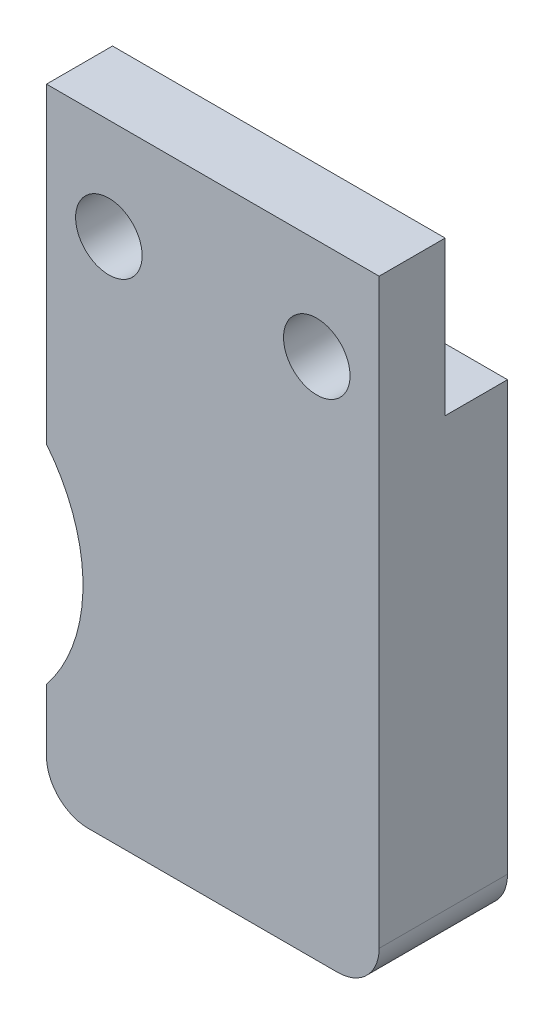
ISO-10303-21;
HEADER;
FILE_DESCRIPTION(('STEP AP214'),'2;1');
FILE_NAME('part.step','',(''),(''),'','','');
FILE_SCHEMA(('AUTOMOTIVE_DESIGN { 1 0 10303 214 1 1 1 1 }'));
ENDSEC;
DATA;
#1=APPLICATION_CONTEXT('core data for automotive mechanical design processes');
#2=APPLICATION_PROTOCOL_DEFINITION('international standard','automotive_design',2000,#1);
#3=PRODUCT_CONTEXT('',#1,'mechanical');
#4=PRODUCT('Part','Part','',(#3));
#5=PRODUCT_RELATED_PRODUCT_CATEGORY('part','',(#4));
#6=PRODUCT_DEFINITION_FORMATION('','',#4);
#7=PRODUCT_DEFINITION_CONTEXT('part definition',#1,'design');
#8=PRODUCT_DEFINITION('design','',#6,#7);
#9=PRODUCT_DEFINITION_SHAPE('','',#8);
#10=(LENGTH_UNIT() NAMED_UNIT(*) SI_UNIT(.MILLI.,.METRE.));
#11=(NAMED_UNIT(*) PLANE_ANGLE_UNIT() SI_UNIT($,.RADIAN.));
#12=(NAMED_UNIT(*) SI_UNIT($,.STERADIAN.) SOLID_ANGLE_UNIT());
#13=UNCERTAINTY_MEASURE_WITH_UNIT(LENGTH_MEASURE(1.E-05),#10,'distance_accuracy_value','');
#14=(GEOMETRIC_REPRESENTATION_CONTEXT(3) GLOBAL_UNCERTAINTY_ASSIGNED_CONTEXT((#13)) GLOBAL_UNIT_ASSIGNED_CONTEXT((#10,
#11,#12)) REPRESENTATION_CONTEXT('',''));
#15=CARTESIAN_POINT('',(0.,0.,0.));
#16=DIRECTION('',(0.,0.,1.));
#17=DIRECTION('',(1.,0.,0.));
#18=AXIS2_PLACEMENT_3D('',#15,#16,#17);
#19=CARTESIAN_POINT('',(-8.,-50.,3.175));
#20=DIRECTION('',(1.,0.,0.));
#21=DIRECTION('',(0.,1.,0.));
#22=AXIS2_PLACEMENT_3D('',#19,#20,#21);
#23=PLANE('',#22);
#24=DIRECTION('',(0.,1.,0.));
#25=VECTOR('',#24,1.);
#26=CARTESIAN_POINT('',(-8.,-50.,-3.));
#27=LINE('',#26,#25);
#28=CARTESIAN_POINT('',(-8.00000000000001,-35.,-3.));
#29=VERTEX_POINT('',#28);
#30=CARTESIAN_POINT('',(-8.00000000000001,-27.4,-3.));
#31=VERTEX_POINT('',#30);
#32=EDGE_CURVE('E143',#29,#31,#27,.T.);
#33=ORIENTED_EDGE('',*,*,#32,.F.);
#34=DIRECTION('',(0.,0.,1.));
#35=VECTOR('',#34,1.);
#36=CARTESIAN_POINT('',(-8.00000000000001,-35.,-3.));
#37=LINE('',#36,#35);
#38=CARTESIAN_POINT('',(-8.00000000000001,-35.,3.175));
#39=VERTEX_POINT('',#38);
#40=EDGE_CURVE('E61',#29,#39,#37,.T.);
#41=ORIENTED_EDGE('',*,*,#40,.T.);
#42=DIRECTION('',(0.,-1.,0.));
#43=VECTOR('',#42,1.);
#44=CARTESIAN_POINT('',(-8.,-50.,3.175));
#45=LINE('',#44,#43);
#46=CARTESIAN_POINT('',(-8.00000000000001,-20.,3.175));
#47=VERTEX_POINT('',#46);
#48=EDGE_CURVE('E188',#47,#39,#45,.T.);
#49=ORIENTED_EDGE('',*,*,#48,.F.);
#50=DIRECTION('',(0.,0.,-1.));
#51=VECTOR('',#50,1.);
#52=CARTESIAN_POINT('',(-8.00000000000001,-20.,3.175));
#53=LINE('',#52,#51);
#54=CARTESIAN_POINT('',(-8.00000000000001,-20.,0.));
#55=VERTEX_POINT('',#54);
#56=EDGE_CURVE('E196',#47,#55,#53,.T.);
#57=ORIENTED_EDGE('',*,*,#56,.T.);
#58=DIRECTION('',(0.,-1.,0.));
#59=VECTOR('',#58,1.);
#60=CARTESIAN_POINT('',(-8.,-50.,0.));
#61=LINE('',#60,#59);
#62=CARTESIAN_POINT('',(-8.00000000000001,-27.4,0.));
#63=VERTEX_POINT('',#62);
#64=EDGE_CURVE('E185',#55,#63,#61,.T.);
#65=ORIENTED_EDGE('',*,*,#64,.T.);
#66=DIRECTION('',(0.,0.,1.));
#67=VECTOR('',#66,1.);
#68=CARTESIAN_POINT('',(-8.00000000000001,-27.4,-3.));
#69=LINE('',#68,#67);
#70=EDGE_CURVE('E160',#31,#63,#69,.T.);
#71=ORIENTED_EDGE('',*,*,#70,.F.);
#72=EDGE_LOOP('',(#33,#41,#49,#57,#65,#71));
#73=FACE_BOUND('',#72,.T.);
#74=ADVANCED_FACE('F45',(#73),#23,.F.);
#75=CARTESIAN_POINT('',(0.,0.,3.175));
#76=DIRECTION('',(0.,0.,-1.));
#77=DIRECTION('',(-1.,0.,0.));
#78=AXIS2_PLACEMENT_3D('',#75,#76,#77);
#79=PLANE('',#78);
#80=ORIENTED_EDGE('',*,*,#48,.T.);
#81=CARTESIAN_POINT('',(-14.2449979983984,-40.,3.175));
#82=DIRECTION('',(0.,0.,1.));
#83=DIRECTION('',(1.,0.,0.));
#84=AXIS2_PLACEMENT_3D('',#81,#82,#83);
#85=CIRCLE('',#84,8.);
#86=CARTESIAN_POINT('',(-8.00000000000001,-45.,3.175));
#87=VERTEX_POINT('',#86);
#88=EDGE_CURVE('E128',#87,#39,#85,.T.);
#89=ORIENTED_EDGE('',*,*,#88,.F.);
#90=CARTESIAN_POINT('',(-8.,-48.,3.175));
#91=VERTEX_POINT('',#90);
#92=EDGE_CURVE('E69',#87,#91,#45,.T.);
#93=ORIENTED_EDGE('',*,*,#92,.T.);
#94=CARTESIAN_POINT('',(-6.,-48.,3.175));
#95=DIRECTION('',(0.,0.,-1.));
#96=DIRECTION('',(-1.,0.,0.));
#97=AXIS2_PLACEMENT_3D('',#94,#95,#96);
#98=CIRCLE('',#97,2.);
#99=CARTESIAN_POINT('',(-6.,-50.,3.175));
#100=VERTEX_POINT('',#99);
#101=EDGE_CURVE('E228',#91,#100,#98,.F.);
#102=ORIENTED_EDGE('',*,*,#101,.T.);
#103=DIRECTION('',(1.,0.,0.));
#104=VECTOR('',#103,1.);
#105=CARTESIAN_POINT('',(-8.,-50.,3.175));
#106=LINE('',#105,#104);
#107=CARTESIAN_POINT('',(6.,-50.,3.175));
#108=VERTEX_POINT('',#107);
#109=EDGE_CURVE('E192',#100,#108,#106,.T.);
#110=ORIENTED_EDGE('',*,*,#109,.T.);
#111=CARTESIAN_POINT('',(6.,-48.,3.175));
#112=DIRECTION('',(0.,0.,-1.));
#113=DIRECTION('',(-1.,0.,0.));
#114=AXIS2_PLACEMENT_3D('',#111,#112,#113);
#115=CIRCLE('',#114,2.);
#116=CARTESIAN_POINT('',(8.,-48.,3.175));
#117=VERTEX_POINT('',#116);
#118=EDGE_CURVE('E54',#108,#117,#115,.F.);
#119=ORIENTED_EDGE('',*,*,#118,.T.);
#120=DIRECTION('',(0.,1.,0.));
#121=VECTOR('',#120,1.);
#122=CARTESIAN_POINT('',(8.,-50.,3.175));
#123=LINE('',#122,#121);
#124=CARTESIAN_POINT('',(8.,-20.,3.175));
#125=VERTEX_POINT('',#124);
#126=EDGE_CURVE('E181',#117,#125,#123,.T.);
#127=ORIENTED_EDGE('',*,*,#126,.T.);
#128=DIRECTION('',(-1.,0.,0.));
#129=VECTOR('',#128,1.);
#130=CARTESIAN_POINT('',(-8.00000000000001,-20.,3.175));
#131=LINE('',#130,#129);
#132=EDGE_CURVE('E184',#125,#47,#131,.T.);
#133=ORIENTED_EDGE('',*,*,#132,.T.);
#134=EDGE_LOOP('',(#80,#89,#93,#102,#110,#119,#127,#133));
#135=FACE_BOUND('',#134,.T.);
#136=CARTESIAN_POINT('',(-5.00000000000001,-24.85,3.175));
#137=DIRECTION('',(0.,0.,1.));
#138=DIRECTION('',(1.,0.,0.));
#139=AXIS2_PLACEMENT_3D('',#136,#137,#138);
#140=CIRCLE('',#139,1.6);
#141=CARTESIAN_POINT('',(-3.40000000000001,-24.85,3.175));
#142=VERTEX_POINT('',#141);
#143=EDGE_CURVE('E173',#142,#142,#140,.T.);
#144=ORIENTED_EDGE('',*,*,#143,.F.);
#145=EDGE_LOOP('',(#144));
#146=FACE_BOUND('',#145,.T.);
#147=CARTESIAN_POINT('',(4.99999999999999,-24.85,3.175));
#148=DIRECTION('',(0.,0.,1.));
#149=DIRECTION('',(1.,0.,0.));
#150=AXIS2_PLACEMENT_3D('',#147,#148,#149);
#151=CIRCLE('',#150,1.59999999999999);
#152=CARTESIAN_POINT('',(6.59999999999999,-24.85,3.175));
#153=VERTEX_POINT('',#152);
#154=EDGE_CURVE('E165',#153,#153,#151,.T.);
#155=ORIENTED_EDGE('',*,*,#154,.F.);
#156=EDGE_LOOP('',(#155));
#157=FACE_BOUND('',#156,.T.);
#158=ADVANCED_FACE('F233',(#135,#146,#157),#79,.F.);
#159=CARTESIAN_POINT('',(0.,0.,0.));
#160=DIRECTION('',(0.,0.,-1.));
#161=DIRECTION('',(-1.,0.,0.));
#162=AXIS2_PLACEMENT_3D('',#159,#160,#161);
#163=PLANE('',#162);
#164=DIRECTION('',(1.,0.,0.));
#165=VECTOR('',#164,1.);
#166=CARTESIAN_POINT('',(8.,-27.4,0.));
#167=LINE('',#166,#165);
#168=CARTESIAN_POINT('',(8.,-27.4,0.));
#169=VERTEX_POINT('',#168);
#170=EDGE_CURVE('E136',#63,#169,#167,.T.);
#171=ORIENTED_EDGE('',*,*,#170,.F.);
#172=ORIENTED_EDGE('',*,*,#64,.F.);
#173=DIRECTION('',(-1.,0.,0.));
#174=VECTOR('',#173,1.);
#175=CARTESIAN_POINT('',(-8.00000000000001,-20.,0.));
#176=LINE('',#175,#174);
#177=CARTESIAN_POINT('',(8.,-20.,0.));
#178=VERTEX_POINT('',#177);
#179=EDGE_CURVE('E199',#178,#55,#176,.T.);
#180=ORIENTED_EDGE('',*,*,#179,.F.);
#181=DIRECTION('',(0.,1.,0.));
#182=VECTOR('',#181,1.);
#183=CARTESIAN_POINT('',(8.,-50.,0.));
#184=LINE('',#183,#182);
#185=EDGE_CURVE('E177',#169,#178,#184,.T.);
#186=ORIENTED_EDGE('',*,*,#185,.F.);
#187=EDGE_LOOP('',(#171,#172,#180,#186));
#188=FACE_BOUND('',#187,.T.);
#189=CARTESIAN_POINT('',(-5.00000000000001,-24.85,0.));
#190=DIRECTION('',(0.,0.,1.));
#191=DIRECTION('',(1.,0.,0.));
#192=AXIS2_PLACEMENT_3D('',#189,#190,#191);
#193=CIRCLE('',#192,1.6);
#194=CARTESIAN_POINT('',(-3.40000000000001,-24.85,0.));
#195=VERTEX_POINT('',#194);
#196=EDGE_CURVE('E169',#195,#195,#193,.T.);
#197=ORIENTED_EDGE('',*,*,#196,.T.);
#198=EDGE_LOOP('',(#197));
#199=FACE_BOUND('',#198,.T.);
#200=CARTESIAN_POINT('',(4.99999999999999,-24.85,0.));
#201=DIRECTION('',(0.,0.,1.));
#202=DIRECTION('',(1.,0.,0.));
#203=AXIS2_PLACEMENT_3D('',#200,#201,#202);
#204=CIRCLE('',#203,1.59999999999999);
#205=CARTESIAN_POINT('',(6.59999999999999,-24.85,0.));
#206=VERTEX_POINT('',#205);
#207=EDGE_CURVE('E164',#206,#206,#204,.T.);
#208=ORIENTED_EDGE('',*,*,#207,.T.);
#209=EDGE_LOOP('',(#208));
#210=FACE_BOUND('',#209,.T.);
#211=ADVANCED_FACE('F265',(#188,#199,#210),#163,.T.);
#212=CARTESIAN_POINT('',(8.,-50.,3.175));
#213=DIRECTION('',(-1.,0.,0.));
#214=DIRECTION('',(0.,0.,1.));
#215=AXIS2_PLACEMENT_3D('',#212,#213,#214);
#216=PLANE('',#215);
#217=ORIENTED_EDGE('',*,*,#126,.F.);
#218=DIRECTION('',(0.,0.,-1.));
#219=VECTOR('',#218,1.);
#220=CARTESIAN_POINT('',(8.,-48.,3.175));
#221=LINE('',#220,#219);
#222=CARTESIAN_POINT('',(8.,-48.,-3.));
#223=VERTEX_POINT('',#222);
#224=EDGE_CURVE('E212',#117,#223,#221,.T.);
#225=ORIENTED_EDGE('',*,*,#224,.T.);
#226=DIRECTION('',(0.,-1.,0.));
#227=VECTOR('',#226,1.);
#228=CARTESIAN_POINT('',(8.,-50.,-3.));
#229=LINE('',#228,#227);
#230=CARTESIAN_POINT('',(8.,-27.4,-3.));
#231=VERTEX_POINT('',#230);
#232=EDGE_CURVE('E156',#231,#223,#229,.T.);
#233=ORIENTED_EDGE('',*,*,#232,.F.);
#234=DIRECTION('',(0.,0.,1.));
#235=VECTOR('',#234,1.);
#236=CARTESIAN_POINT('',(8.,-27.4,-3.));
#237=LINE('',#236,#235);
#238=EDGE_CURVE('E147',#231,#169,#237,.T.);
#239=ORIENTED_EDGE('',*,*,#238,.T.);
#240=ORIENTED_EDGE('',*,*,#185,.T.);
#241=DIRECTION('',(0.,0.,-1.));
#242=VECTOR('',#241,1.);
#243=CARTESIAN_POINT('',(8.,-20.,3.175));
#244=LINE('',#243,#242);
#245=EDGE_CURVE('E208',#125,#178,#244,.T.);
#246=ORIENTED_EDGE('',*,*,#245,.F.);
#247=EDGE_LOOP('',(#217,#225,#233,#239,#240,#246));
#248=FACE_BOUND('',#247,.T.);
#249=ADVANCED_FACE('F242',(#248),#216,.F.);
#250=CARTESIAN_POINT('',(-8.00000000000001,-20.,3.175));
#251=DIRECTION('',(0.,-1.,0.));
#252=DIRECTION('',(1.,0.,0.));
#253=AXIS2_PLACEMENT_3D('',#250,#251,#252);
#254=PLANE('',#253);
#255=ORIENTED_EDGE('',*,*,#179,.T.);
#256=ORIENTED_EDGE('',*,*,#56,.F.);
#257=ORIENTED_EDGE('',*,*,#132,.F.);
#258=ORIENTED_EDGE('',*,*,#245,.T.);
#259=EDGE_LOOP('',(#255,#256,#257,#258));
#260=FACE_BOUND('',#259,.T.);
#261=ADVANCED_FACE('F261',(#260),#254,.F.);
#262=ORIENTED_EDGE('',*,*,#92,.F.);
#263=DIRECTION('',(0.,0.,1.));
#264=VECTOR('',#263,1.);
#265=CARTESIAN_POINT('',(-8.00000000000001,-45.,-3.));
#266=LINE('',#265,#264);
#267=CARTESIAN_POINT('',(-8.00000000000001,-45.,-3.));
#268=VERTEX_POINT('',#267);
#269=EDGE_CURVE('E123',#268,#87,#266,.T.);
#270=ORIENTED_EDGE('',*,*,#269,.F.);
#271=CARTESIAN_POINT('',(-8.,-48.,-3.));
#272=VERTEX_POINT('',#271);
#273=EDGE_CURVE('E133',#272,#268,#27,.T.);
#274=ORIENTED_EDGE('',*,*,#273,.F.);
#275=DIRECTION('',(0.,0.,-1.));
#276=VECTOR('',#275,1.);
#277=CARTESIAN_POINT('',(-8.,-48.,3.175));
#278=LINE('',#277,#276);
#279=EDGE_CURVE('E11',#272,#91,#278,.F.);
#280=ORIENTED_EDGE('',*,*,#279,.T.);
#281=EDGE_LOOP('',(#262,#270,#274,#280));
#282=FACE_BOUND('',#281,.T.);
#283=ADVANCED_FACE('F132',(#282),#23,.F.);
#284=CARTESIAN_POINT('',(-8.,-50.,3.175));
#285=DIRECTION('',(0.,1.,0.));
#286=DIRECTION('',(0.,0.,1.));
#287=AXIS2_PLACEMENT_3D('',#284,#285,#286);
#288=PLANE('',#287);
#289=DIRECTION('',(-1.,0.,0.));
#290=VECTOR('',#289,1.);
#291=CARTESIAN_POINT('',(8.,-50.,-3.));
#292=LINE('',#291,#290);
#293=CARTESIAN_POINT('',(6.,-50.,-3.));
#294=VERTEX_POINT('',#293);
#295=CARTESIAN_POINT('',(-6.,-50.,-3.));
#296=VERTEX_POINT('',#295);
#297=EDGE_CURVE('E149',#294,#296,#292,.T.);
#298=ORIENTED_EDGE('',*,*,#297,.F.);
#299=DIRECTION('',(0.,0.,-1.));
#300=VECTOR('',#299,1.);
#301=CARTESIAN_POINT('',(6.,-50.,3.175));
#302=LINE('',#301,#300);
#303=EDGE_CURVE('E225',#294,#108,#302,.F.);
#304=ORIENTED_EDGE('',*,*,#303,.T.);
#305=ORIENTED_EDGE('',*,*,#109,.F.);
#306=DIRECTION('',(0.,0.,-1.));
#307=VECTOR('',#306,1.);
#308=CARTESIAN_POINT('',(-6.,-50.,3.175));
#309=LINE('',#308,#307);
#310=EDGE_CURVE('E221',#100,#296,#309,.T.);
#311=ORIENTED_EDGE('',*,*,#310,.T.);
#312=EDGE_LOOP('',(#298,#304,#305,#311));
#313=FACE_BOUND('',#312,.T.);
#314=ADVANCED_FACE('F248',(#313),#288,.F.);
#315=CARTESIAN_POINT('',(-5.00000000000001,-24.85,3.175));
#316=DIRECTION('',(0.,0.,-1.));
#317=DIRECTION('',(-1.,0.,0.));
#318=AXIS2_PLACEMENT_3D('',#315,#316,#317);
#319=CYLINDRICAL_SURFACE('',#318,1.6);
#320=ORIENTED_EDGE('',*,*,#143,.T.);
#321=EDGE_LOOP('',(#320));
#322=FACE_BOUND('',#321,.T.);
#323=ORIENTED_EDGE('',*,*,#196,.F.);
#324=EDGE_LOOP('',(#323));
#325=FACE_BOUND('',#324,.T.);
#326=ADVANCED_FACE('F281',(#322,#325),#319,.F.);
#327=CARTESIAN_POINT('',(4.99999999999999,-24.85,3.175));
#328=DIRECTION('',(0.,0.,-1.));
#329=DIRECTION('',(-1.,0.,0.));
#330=AXIS2_PLACEMENT_3D('',#327,#328,#329);
#331=CYLINDRICAL_SURFACE('',#330,1.59999999999999);
#332=ORIENTED_EDGE('',*,*,#154,.T.);
#333=EDGE_LOOP('',(#332));
#334=FACE_BOUND('',#333,.T.);
#335=ORIENTED_EDGE('',*,*,#207,.F.);
#336=EDGE_LOOP('',(#335));
#337=FACE_BOUND('',#336,.T.);
#338=ADVANCED_FACE('F272',(#334,#337),#331,.F.);
#339=CARTESIAN_POINT('',(8.,-27.4,-3.));
#340=DIRECTION('',(0.,-1.,0.));
#341=DIRECTION('',(0.,0.,-1.));
#342=AXIS2_PLACEMENT_3D('',#339,#340,#341);
#343=PLANE('',#342);
#344=ORIENTED_EDGE('',*,*,#170,.T.);
#345=ORIENTED_EDGE('',*,*,#238,.F.);
#346=DIRECTION('',(1.,0.,0.));
#347=VECTOR('',#346,1.);
#348=CARTESIAN_POINT('',(8.,-27.4,-3.));
#349=LINE('',#348,#347);
#350=EDGE_CURVE('E142',#31,#231,#349,.T.);
#351=ORIENTED_EDGE('',*,*,#350,.F.);
#352=ORIENTED_EDGE('',*,*,#70,.T.);
#353=EDGE_LOOP('',(#344,#345,#351,#352));
#354=FACE_BOUND('',#353,.T.);
#355=ADVANCED_FACE('F269',(#354),#343,.F.);
#356=CARTESIAN_POINT('',(0.,0.,-3.));
#357=DIRECTION('',(0.,0.,1.));
#358=DIRECTION('',(1.,0.,0.));
#359=AXIS2_PLACEMENT_3D('',#356,#357,#358);
#360=PLANE('',#359);
#361=ORIENTED_EDGE('',*,*,#273,.T.);
#362=CARTESIAN_POINT('',(-14.2449979983984,-40.,-3.));
#363=DIRECTION('',(0.,0.,1.));
#364=DIRECTION('',(1.,0.,0.));
#365=AXIS2_PLACEMENT_3D('',#362,#363,#364);
#366=CIRCLE('',#365,8.);
#367=EDGE_CURVE('E120',#268,#29,#366,.T.);
#368=ORIENTED_EDGE('',*,*,#367,.T.);
#369=ORIENTED_EDGE('',*,*,#32,.T.);
#370=ORIENTED_EDGE('',*,*,#350,.T.);
#371=ORIENTED_EDGE('',*,*,#232,.T.);
#372=CARTESIAN_POINT('',(6.,-48.,-3.));
#373=DIRECTION('',(0.,0.,1.));
#374=DIRECTION('',(1.,0.,0.));
#375=AXIS2_PLACEMENT_3D('',#372,#373,#374);
#376=CIRCLE('',#375,2.);
#377=EDGE_CURVE('E218',#223,#294,#376,.F.);
#378=ORIENTED_EDGE('',*,*,#377,.T.);
#379=ORIENTED_EDGE('',*,*,#297,.T.);
#380=CARTESIAN_POINT('',(-6.,-48.,-3.));
#381=DIRECTION('',(0.,0.,1.));
#382=DIRECTION('',(1.,0.,0.));
#383=AXIS2_PLACEMENT_3D('',#380,#381,#382);
#384=CIRCLE('',#383,2.);
#385=EDGE_CURVE('E140',#296,#272,#384,.F.);
#386=ORIENTED_EDGE('',*,*,#385,.T.);
#387=EDGE_LOOP('',(#361,#368,#369,#370,#371,#378,#379,#386));
#388=FACE_BOUND('',#387,.T.);
#389=ADVANCED_FACE('F138',(#388),#360,.F.);
#390=CARTESIAN_POINT('',(6.,-48.,3.175));
#391=DIRECTION('',(0.,0.,-1.));
#392=DIRECTION('',(-1.,0.,0.));
#393=AXIS2_PLACEMENT_3D('',#390,#391,#392);
#394=CYLINDRICAL_SURFACE('',#393,2.);
#395=ORIENTED_EDGE('',*,*,#118,.F.);
#396=ORIENTED_EDGE('',*,*,#303,.F.);
#397=ORIENTED_EDGE('',*,*,#377,.F.);
#398=ORIENTED_EDGE('',*,*,#224,.F.);
#399=EDGE_LOOP('',(#395,#396,#397,#398));
#400=FACE_BOUND('',#399,.T.);
#401=ADVANCED_FACE('F245',(#400),#394,.T.);
#402=CARTESIAN_POINT('',(-6.,-48.,3.175));
#403=DIRECTION('',(0.,0.,-1.));
#404=DIRECTION('',(-1.,0.,0.));
#405=AXIS2_PLACEMENT_3D('',#402,#403,#404);
#406=CYLINDRICAL_SURFACE('',#405,2.);
#407=ORIENTED_EDGE('',*,*,#101,.F.);
#408=ORIENTED_EDGE('',*,*,#279,.F.);
#409=ORIENTED_EDGE('',*,*,#385,.F.);
#410=ORIENTED_EDGE('',*,*,#310,.F.);
#411=EDGE_LOOP('',(#407,#408,#409,#410));
#412=FACE_BOUND('',#411,.T.);
#413=ADVANCED_FACE('F47',(#412),#406,.T.);
#414=CARTESIAN_POINT('',(-14.2449979983984,-40.,-3.));
#415=DIRECTION('',(0.,0.,1.));
#416=DIRECTION('',(1.,0.,0.));
#417=AXIS2_PLACEMENT_3D('',#414,#415,#416);
#418=CYLINDRICAL_SURFACE('',#417,8.);
#419=ORIENTED_EDGE('',*,*,#88,.T.);
#420=ORIENTED_EDGE('',*,*,#40,.F.);
#421=ORIENTED_EDGE('',*,*,#367,.F.);
#422=ORIENTED_EDGE('',*,*,#269,.T.);
#423=EDGE_LOOP('',(#419,#420,#421,#422));
#424=FACE_BOUND('',#423,.T.);
#425=ADVANCED_FACE('F122',(#424),#418,.F.);
#426=CLOSED_SHELL('',(#74,#158,#211,#249,#261,#283,#314,#326,#338,#355,#389,#401,#413,#425));
#427=MANIFOLD_SOLID_BREP('B2',#426);
#428=ADVANCED_BREP_SHAPE_REPRESENTATION('',(#18,#427),#14);
#429=SHAPE_DEFINITION_REPRESENTATION(#9,#428);
ENDSEC;
END-ISO-10303-21;
